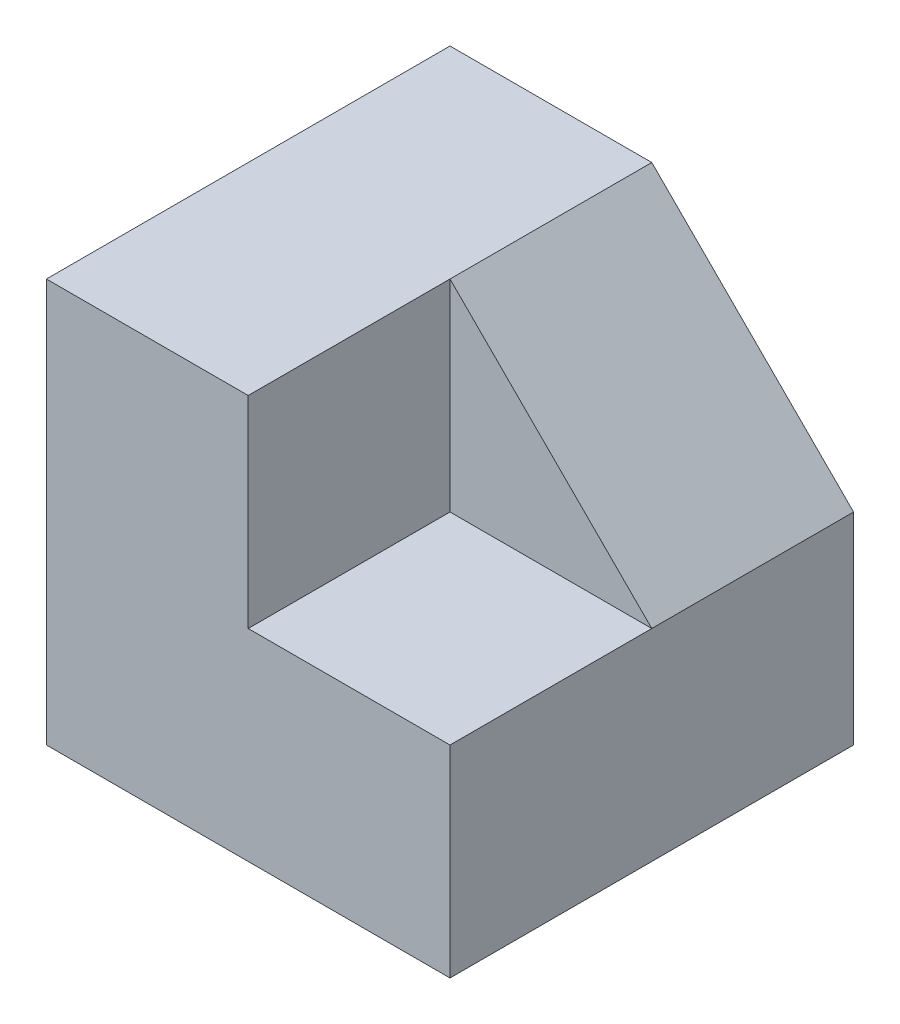
ISO-10303-21;
HEADER;
FILE_DESCRIPTION(('STEP AP214'),'2;1');
FILE_NAME('part.step','',(''),(''),'','','');
FILE_SCHEMA(('AUTOMOTIVE_DESIGN { 1 0 10303 214 1 1 1 1 }'));
ENDSEC;
DATA;
#1=APPLICATION_CONTEXT('core data for automotive mechanical design processes');
#2=APPLICATION_PROTOCOL_DEFINITION('international standard','automotive_design',2000,#1);
#3=PRODUCT_CONTEXT('',#1,'mechanical');
#4=PRODUCT('Part','Part','',(#3));
#5=PRODUCT_RELATED_PRODUCT_CATEGORY('part','',(#4));
#6=PRODUCT_DEFINITION_FORMATION('','',#4);
#7=PRODUCT_DEFINITION_CONTEXT('part definition',#1,'design');
#8=PRODUCT_DEFINITION('design','',#6,#7);
#9=PRODUCT_DEFINITION_SHAPE('','',#8);
#10=(LENGTH_UNIT() NAMED_UNIT(*) SI_UNIT(.MILLI.,.METRE.));
#11=(NAMED_UNIT(*) PLANE_ANGLE_UNIT() SI_UNIT($,.RADIAN.));
#12=(NAMED_UNIT(*) SI_UNIT($,.STERADIAN.) SOLID_ANGLE_UNIT());
#13=UNCERTAINTY_MEASURE_WITH_UNIT(LENGTH_MEASURE(1.E-05),#10,'distance_accuracy_value','');
#14=(GEOMETRIC_REPRESENTATION_CONTEXT(3) GLOBAL_UNCERTAINTY_ASSIGNED_CONTEXT((#13)) GLOBAL_UNIT_ASSIGNED_CONTEXT((#10,
#11,#12)) REPRESENTATION_CONTEXT('',''));
#15=CARTESIAN_POINT('',(0.,0.,0.));
#16=DIRECTION('',(0.,0.,1.));
#17=DIRECTION('',(1.,0.,0.));
#18=AXIS2_PLACEMENT_3D('',#15,#16,#17);
#19=CARTESIAN_POINT('',(30.,30.,30.));
#20=DIRECTION('',(0.,0.,1.));
#21=DIRECTION('',(1.,0.,0.));
#22=AXIS2_PLACEMENT_3D('',#19,#20,#21);
#23=PLANE('',#22);
#24=DIRECTION('',(-1.,0.,0.));
#25=VECTOR('',#24,1.);
#26=CARTESIAN_POINT('',(30.,0.,30.));
#27=LINE('',#26,#25);
#28=CARTESIAN_POINT('',(30.,0.,30.));
#29=VERTEX_POINT('',#28);
#30=CARTESIAN_POINT('',(-30.,0.,30.));
#31=VERTEX_POINT('',#30);
#32=EDGE_CURVE('E151',#29,#31,#27,.T.);
#33=ORIENTED_EDGE('',*,*,#32,.F.);
#34=DIRECTION('',(0.,-1.,0.));
#35=VECTOR('',#34,1.);
#36=CARTESIAN_POINT('',(30.,30.,30.));
#37=LINE('',#36,#35);
#38=CARTESIAN_POINT('',(30.,30.,30.));
#39=VERTEX_POINT('',#38);
#40=EDGE_CURVE('E168',#39,#29,#37,.T.);
#41=ORIENTED_EDGE('',*,*,#40,.F.);
#42=DIRECTION('',(-1.,0.,0.));
#43=VECTOR('',#42,1.);
#44=CARTESIAN_POINT('',(30.,30.,30.));
#45=LINE('',#44,#43);
#46=CARTESIAN_POINT('',(0.,30.,30.));
#47=VERTEX_POINT('',#46);
#48=EDGE_CURVE('E152',#39,#47,#45,.T.);
#49=ORIENTED_EDGE('',*,*,#48,.T.);
#50=DIRECTION('',(0.,-1.,0.));
#51=VECTOR('',#50,1.);
#52=CARTESIAN_POINT('',(0.,60.,30.));
#53=LINE('',#52,#51);
#54=CARTESIAN_POINT('',(0.,60.,30.));
#55=VERTEX_POINT('',#54);
#56=EDGE_CURVE('E120',#55,#47,#53,.T.);
#57=ORIENTED_EDGE('',*,*,#56,.F.);
#58=DIRECTION('',(1.,0.,0.));
#59=VECTOR('',#58,1.);
#60=CARTESIAN_POINT('',(-30.,60.,30.));
#61=LINE('',#60,#59);
#62=CARTESIAN_POINT('',(-30.,60.,30.));
#63=VERTEX_POINT('',#62);
#64=EDGE_CURVE('E117',#63,#55,#61,.T.);
#65=ORIENTED_EDGE('',*,*,#64,.F.);
#66=DIRECTION('',(0.,-1.,0.));
#67=VECTOR('',#66,1.);
#68=CARTESIAN_POINT('',(-30.,30.,30.));
#69=LINE('',#68,#67);
#70=EDGE_CURVE('E101',#63,#31,#69,.T.);
#71=ORIENTED_EDGE('',*,*,#70,.T.);
#72=EDGE_LOOP('',(#33,#41,#49,#57,#65,#71));
#73=FACE_BOUND('',#72,.T.);
#74=ADVANCED_FACE('F41',(#73),#23,.T.);
#75=CARTESIAN_POINT('',(30.,30.,-30.));
#76=DIRECTION('',(1.,0.,0.));
#77=DIRECTION('',(0.,0.,-1.));
#78=AXIS2_PLACEMENT_3D('',#75,#76,#77);
#79=PLANE('',#78);
#80=DIRECTION('',(0.,-1.,0.));
#81=VECTOR('',#80,1.);
#82=CARTESIAN_POINT('',(30.,30.,-30.));
#83=LINE('',#82,#81);
#84=CARTESIAN_POINT('',(30.,30.,-30.));
#85=VERTEX_POINT('',#84);
#86=CARTESIAN_POINT('',(30.,0.,-30.));
#87=VERTEX_POINT('',#86);
#88=EDGE_CURVE('E172',#85,#87,#83,.T.);
#89=ORIENTED_EDGE('',*,*,#88,.F.);
#90=DIRECTION('',(0.,0.,1.));
#91=VECTOR('',#90,1.);
#92=CARTESIAN_POINT('',(30.,30.,-30.));
#93=LINE('',#92,#91);
#94=CARTESIAN_POINT('',(30.,30.,0.));
#95=VERTEX_POINT('',#94);
#96=EDGE_CURVE('E51',#85,#95,#93,.T.);
#97=ORIENTED_EDGE('',*,*,#96,.T.);
#98=DIRECTION('',(0.,0.,1.));
#99=VECTOR('',#98,1.);
#100=CARTESIAN_POINT('',(30.,30.,-30.));
#101=LINE('',#100,#99);
#102=EDGE_CURVE('E114',#95,#39,#101,.T.);
#103=ORIENTED_EDGE('',*,*,#102,.T.);
#104=ORIENTED_EDGE('',*,*,#40,.T.);
#105=DIRECTION('',(0.,0.,1.));
#106=VECTOR('',#105,1.);
#107=CARTESIAN_POINT('',(30.,0.,-30.));
#108=LINE('',#107,#106);
#109=EDGE_CURVE('E155',#87,#29,#108,.T.);
#110=ORIENTED_EDGE('',*,*,#109,.F.);
#111=EDGE_LOOP('',(#89,#97,#103,#104,#110));
#112=FACE_BOUND('',#111,.T.);
#113=ADVANCED_FACE('F183',(#112),#79,.T.);
#114=CARTESIAN_POINT('',(30.,30.,-30.));
#115=DIRECTION('',(0.,0.,1.));
#116=DIRECTION('',(1.,0.,0.));
#117=AXIS2_PLACEMENT_3D('',#114,#115,#116);
#118=PLANE('',#117);
#119=DIRECTION('',(-1.,0.,0.));
#120=VECTOR('',#119,1.);
#121=CARTESIAN_POINT('',(30.,60.,-30.));
#122=LINE('',#121,#120);
#123=CARTESIAN_POINT('',(0.,60.,-30.));
#124=VERTEX_POINT('',#123);
#125=CARTESIAN_POINT('',(-30.,60.,-30.));
#126=VERTEX_POINT('',#125);
#127=EDGE_CURVE('E128',#124,#126,#122,.T.);
#128=ORIENTED_EDGE('',*,*,#127,.F.);
#129=DIRECTION('',(-0.707106781186547,0.707106781186548,0.));
#130=VECTOR('',#129,1.);
#131=CARTESIAN_POINT('',(0.,60.,-30.));
#132=LINE('',#131,#130);
#133=EDGE_CURVE('E58',#124,#85,#132,.F.);
#134=ORIENTED_EDGE('',*,*,#133,.T.);
#135=ORIENTED_EDGE('',*,*,#88,.T.);
#136=DIRECTION('',(-1.,0.,0.));
#137=VECTOR('',#136,1.);
#138=CARTESIAN_POINT('',(30.,0.,-30.));
#139=LINE('',#138,#137);
#140=CARTESIAN_POINT('',(-30.,0.,-30.));
#141=VERTEX_POINT('',#140);
#142=EDGE_CURVE('E162',#87,#141,#139,.T.);
#143=ORIENTED_EDGE('',*,*,#142,.T.);
#144=DIRECTION('',(0.,-1.,0.));
#145=VECTOR('',#144,1.);
#146=CARTESIAN_POINT('',(-30.,30.,-30.));
#147=LINE('',#146,#145);
#148=EDGE_CURVE('E113',#126,#141,#147,.T.);
#149=ORIENTED_EDGE('',*,*,#148,.F.);
#150=EDGE_LOOP('',(#128,#134,#135,#143,#149));
#151=FACE_BOUND('',#150,.T.);
#152=ADVANCED_FACE('F193',(#151),#118,.F.);
#153=CARTESIAN_POINT('',(-30.,30.,-30.));
#154=DIRECTION('',(1.,0.,0.));
#155=DIRECTION('',(0.,0.,-1.));
#156=AXIS2_PLACEMENT_3D('',#153,#154,#155);
#157=PLANE('',#156);
#158=DIRECTION('',(0.,0.,1.));
#159=VECTOR('',#158,1.);
#160=CARTESIAN_POINT('',(-30.,0.,-30.));
#161=LINE('',#160,#159);
#162=EDGE_CURVE('E108',#141,#31,#161,.T.);
#163=ORIENTED_EDGE('',*,*,#162,.T.);
#164=ORIENTED_EDGE('',*,*,#70,.F.);
#165=DIRECTION('',(0.,0.,1.));
#166=VECTOR('',#165,1.);
#167=CARTESIAN_POINT('',(-30.,60.,-30.));
#168=LINE('',#167,#166);
#169=EDGE_CURVE('E106',#126,#63,#168,.T.);
#170=ORIENTED_EDGE('',*,*,#169,.F.);
#171=ORIENTED_EDGE('',*,*,#148,.T.);
#172=EDGE_LOOP('',(#163,#164,#170,#171));
#173=FACE_BOUND('',#172,.T.);
#174=ADVANCED_FACE('F103',(#173),#157,.F.);
#175=CARTESIAN_POINT('',(0.,30.,0.));
#176=DIRECTION('',(0.,1.,0.));
#177=DIRECTION('',(0.,0.,1.));
#178=AXIS2_PLACEMENT_3D('',#175,#176,#177);
#179=PLANE('',#178);
#180=DIRECTION('',(1.,0.,0.));
#181=VECTOR('',#180,1.);
#182=CARTESIAN_POINT('',(0.,30.,0.));
#183=LINE('',#182,#181);
#184=CARTESIAN_POINT('',(0.,30.,0.));
#185=VERTEX_POINT('',#184);
#186=EDGE_CURVE('E131',#185,#95,#183,.T.);
#187=ORIENTED_EDGE('',*,*,#186,.F.);
#188=DIRECTION('',(0.,0.,-1.));
#189=VECTOR('',#188,1.);
#190=CARTESIAN_POINT('',(0.,30.,30.));
#191=LINE('',#190,#189);
#192=EDGE_CURVE('E135',#47,#185,#191,.T.);
#193=ORIENTED_EDGE('',*,*,#192,.F.);
#194=ORIENTED_EDGE('',*,*,#48,.F.);
#195=ORIENTED_EDGE('',*,*,#102,.F.);
#196=EDGE_LOOP('',(#187,#193,#194,#195));
#197=FACE_BOUND('',#196,.T.);
#198=ADVANCED_FACE('F189',(#197),#179,.T.);
#199=CARTESIAN_POINT('',(0.,0.,0.));
#200=DIRECTION('',(0.,1.,0.));
#201=DIRECTION('',(0.,0.,1.));
#202=AXIS2_PLACEMENT_3D('',#199,#200,#201);
#203=PLANE('',#202);
#204=ORIENTED_EDGE('',*,*,#32,.T.);
#205=ORIENTED_EDGE('',*,*,#162,.F.);
#206=ORIENTED_EDGE('',*,*,#142,.F.);
#207=ORIENTED_EDGE('',*,*,#109,.T.);
#208=EDGE_LOOP('',(#204,#205,#206,#207));
#209=FACE_BOUND('',#208,.T.);
#210=ADVANCED_FACE('F196',(#209),#203,.F.);
#211=CARTESIAN_POINT('',(0.,60.,30.));
#212=DIRECTION('',(-1.,0.,0.));
#213=DIRECTION('',(0.,0.,1.));
#214=AXIS2_PLACEMENT_3D('',#211,#212,#213);
#215=PLANE('',#214);
#216=ORIENTED_EDGE('',*,*,#192,.T.);
#217=DIRECTION('',(0.,-1.,0.));
#218=VECTOR('',#217,1.);
#219=CARTESIAN_POINT('',(0.,60.,0.));
#220=LINE('',#219,#218);
#221=CARTESIAN_POINT('',(0.,60.,0.));
#222=VERTEX_POINT('',#221);
#223=EDGE_CURVE('E142',#222,#185,#220,.T.);
#224=ORIENTED_EDGE('',*,*,#223,.F.);
#225=DIRECTION('',(0.,0.,-1.));
#226=VECTOR('',#225,1.);
#227=CARTESIAN_POINT('',(0.,60.,30.));
#228=LINE('',#227,#226);
#229=EDGE_CURVE('E125',#55,#222,#228,.T.);
#230=ORIENTED_EDGE('',*,*,#229,.F.);
#231=ORIENTED_EDGE('',*,*,#56,.T.);
#232=EDGE_LOOP('',(#216,#224,#230,#231));
#233=FACE_BOUND('',#232,.T.);
#234=ADVANCED_FACE('F198',(#233),#215,.F.);
#235=CARTESIAN_POINT('',(0.,60.,0.));
#236=DIRECTION('',(0.,0.,-1.));
#237=DIRECTION('',(-1.,0.,0.));
#238=AXIS2_PLACEMENT_3D('',#235,#236,#237);
#239=PLANE('',#238);
#240=ORIENTED_EDGE('',*,*,#186,.T.);
#241=DIRECTION('',(0.707106781186547,-0.707106781186548,0.));
#242=VECTOR('',#241,1.);
#243=CARTESIAN_POINT('',(0.,60.,0.));
#244=LINE('',#243,#242);
#245=EDGE_CURVE('E11',#95,#222,#244,.F.);
#246=ORIENTED_EDGE('',*,*,#245,.T.);
#247=ORIENTED_EDGE('',*,*,#223,.T.);
#248=EDGE_LOOP('',(#240,#246,#247));
#249=FACE_BOUND('',#248,.T.);
#250=ADVANCED_FACE('F191',(#249),#239,.F.);
#251=CARTESIAN_POINT('',(0.,60.,0.));
#252=DIRECTION('',(0.,1.,0.));
#253=DIRECTION('',(0.,0.,1.));
#254=AXIS2_PLACEMENT_3D('',#251,#252,#253);
#255=PLANE('',#254);
#256=ORIENTED_EDGE('',*,*,#229,.T.);
#257=DIRECTION('',(0.,0.,-1.));
#258=VECTOR('',#257,1.);
#259=CARTESIAN_POINT('',(0.,60.,0.));
#260=LINE('',#259,#258);
#261=EDGE_CURVE('E171',#222,#124,#260,.T.);
#262=ORIENTED_EDGE('',*,*,#261,.T.);
#263=ORIENTED_EDGE('',*,*,#127,.T.);
#264=ORIENTED_EDGE('',*,*,#169,.T.);
#265=ORIENTED_EDGE('',*,*,#64,.T.);
#266=EDGE_LOOP('',(#256,#262,#263,#264,#265));
#267=FACE_BOUND('',#266,.T.);
#268=ADVANCED_FACE('F127',(#267),#255,.T.);
#269=CARTESIAN_POINT('',(0.,60.,0.));
#270=DIRECTION('',(-0.707106781186548,-0.707106781186547,0.));
#271=DIRECTION('',(0.,0.,-1.));
#272=AXIS2_PLACEMENT_3D('',#269,#270,#271);
#273=PLANE('',#272);
#274=ORIENTED_EDGE('',*,*,#245,.F.);
#275=ORIENTED_EDGE('',*,*,#96,.F.);
#276=ORIENTED_EDGE('',*,*,#133,.F.);
#277=ORIENTED_EDGE('',*,*,#261,.F.);
#278=EDGE_LOOP('',(#274,#275,#276,#277));
#279=FACE_BOUND('',#278,.T.);
#280=ADVANCED_FACE('F44',(#279),#273,.F.);
#281=CLOSED_SHELL('',(#74,#113,#152,#174,#198,#210,#234,#250,#268,#280));
#282=MANIFOLD_SOLID_BREP('B2',#281);
#283=ADVANCED_BREP_SHAPE_REPRESENTATION('',(#18,#282),#14);
#284=SHAPE_DEFINITION_REPRESENTATION(#9,#283);
ENDSEC;
END-ISO-10303-21;
